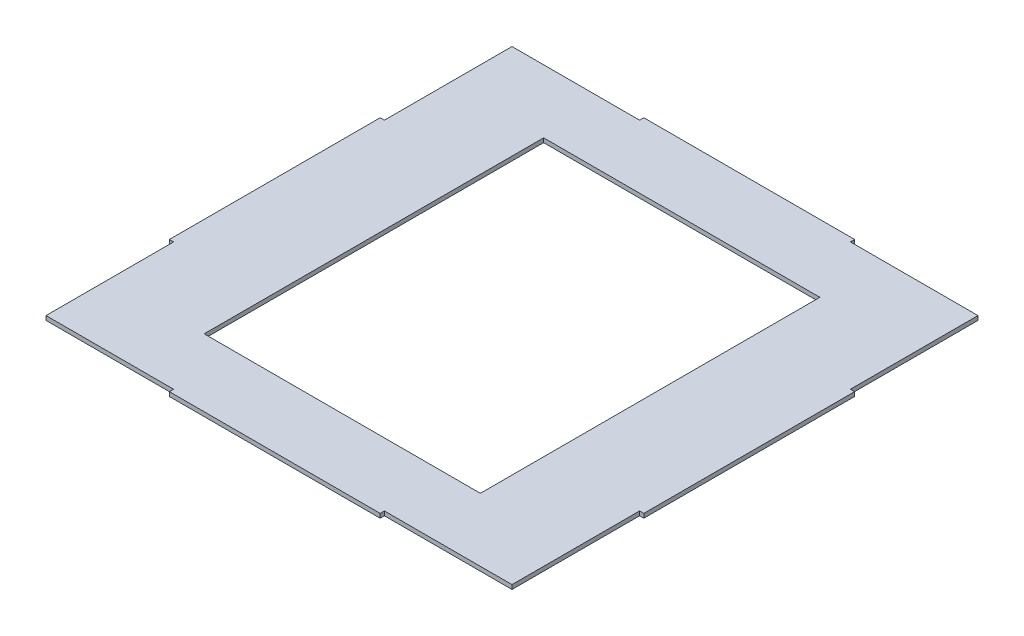
ISO-10303-21;
HEADER;
FILE_DESCRIPTION(('STEP AP214'),'2;1');
FILE_NAME('part.step','',(''),(''),'','','');
FILE_SCHEMA(('AUTOMOTIVE_DESIGN { 1 0 10303 214 1 1 1 1 }'));
ENDSEC;
DATA;
#1=APPLICATION_CONTEXT('core data for automotive mechanical design processes');
#2=APPLICATION_PROTOCOL_DEFINITION('international standard','automotive_design',2000,#1);
#3=PRODUCT_CONTEXT('',#1,'mechanical');
#4=PRODUCT('Part','Part','',(#3));
#5=PRODUCT_RELATED_PRODUCT_CATEGORY('part','',(#4));
#6=PRODUCT_DEFINITION_FORMATION('','',#4);
#7=PRODUCT_DEFINITION_CONTEXT('part definition',#1,'design');
#8=PRODUCT_DEFINITION('design','',#6,#7);
#9=PRODUCT_DEFINITION_SHAPE('','',#8);
#10=(LENGTH_UNIT() NAMED_UNIT(*) SI_UNIT(.MILLI.,.METRE.));
#11=(NAMED_UNIT(*) PLANE_ANGLE_UNIT() SI_UNIT($,.RADIAN.));
#12=(NAMED_UNIT(*) SI_UNIT($,.STERADIAN.) SOLID_ANGLE_UNIT());
#13=UNCERTAINTY_MEASURE_WITH_UNIT(LENGTH_MEASURE(1.E-05),#10,'distance_accuracy_value','');
#14=(GEOMETRIC_REPRESENTATION_CONTEXT(3) GLOBAL_UNCERTAINTY_ASSIGNED_CONTEXT((#13)) GLOBAL_UNIT_ASSIGNED_CONTEXT((#10,
#11,#12)) REPRESENTATION_CONTEXT('',''));
#15=CARTESIAN_POINT('',(0.,0.,0.));
#16=DIRECTION('',(0.,0.,1.));
#17=DIRECTION('',(1.,0.,0.));
#18=AXIS2_PLACEMENT_3D('',#15,#16,#17);
#19=CARTESIAN_POINT('',(0.,4.,-221.));
#20=DIRECTION('',(0.,0.,1.));
#21=DIRECTION('',(1.,0.,0.));
#22=AXIS2_PLACEMENT_3D('',#19,#20,#21);
#23=PLANE('',#22);
#24=DIRECTION('',(-1.,0.,0.));
#25=VECTOR('',#24,1.);
#26=CARTESIAN_POINT('',(0.,0.,-221.));
#27=LINE('',#26,#25);
#28=CARTESIAN_POINT('',(-100.,0.,-221.));
#29=VERTEX_POINT('',#28);
#30=CARTESIAN_POINT('',(-221.,0.,-221.));
#31=VERTEX_POINT('',#30);
#32=EDGE_CURVE('E248',#29,#31,#27,.T.);
#33=ORIENTED_EDGE('',*,*,#32,.T.);
#34=DIRECTION('',(0.,-1.,0.));
#35=VECTOR('',#34,1.);
#36=CARTESIAN_POINT('',(-221.,4.,-221.));
#37=LINE('',#36,#35);
#38=CARTESIAN_POINT('',(-221.,4.,-221.));
#39=VERTEX_POINT('',#38);
#40=EDGE_CURVE('E11',#39,#31,#37,.T.);
#41=ORIENTED_EDGE('',*,*,#40,.F.);
#42=DIRECTION('',(-1.,0.,0.));
#43=VECTOR('',#42,1.);
#44=CARTESIAN_POINT('',(0.,4.,-221.));
#45=LINE('',#44,#43);
#46=CARTESIAN_POINT('',(-100.,4.,-221.));
#47=VERTEX_POINT('',#46);
#48=EDGE_CURVE('E360',#47,#39,#45,.T.);
#49=ORIENTED_EDGE('',*,*,#48,.F.);
#50=DIRECTION('',(0.,-1.,0.));
#51=VECTOR('',#50,1.);
#52=CARTESIAN_POINT('',(-100.,4.,-221.));
#53=LINE('',#52,#51);
#54=EDGE_CURVE('E287',#47,#29,#53,.T.);
#55=ORIENTED_EDGE('',*,*,#54,.T.);
#56=EDGE_LOOP('',(#33,#41,#49,#55));
#57=FACE_BOUND('',#56,.T.);
#58=ADVANCED_FACE('F41',(#57),#23,.F.);
#59=CARTESIAN_POINT('',(-221.,4.,0.));
#60=DIRECTION('',(1.,0.,0.));
#61=DIRECTION('',(0.,0.,-1.));
#62=AXIS2_PLACEMENT_3D('',#59,#60,#61);
#63=PLANE('',#62);
#64=DIRECTION('',(0.,0.,1.));
#65=VECTOR('',#64,1.);
#66=CARTESIAN_POINT('',(-221.,0.,0.));
#67=LINE('',#66,#65);
#68=CARTESIAN_POINT('',(-221.,0.,-99.9999999999997));
#69=VERTEX_POINT('',#68);
#70=EDGE_CURVE('E251',#31,#69,#67,.T.);
#71=ORIENTED_EDGE('',*,*,#70,.T.);
#72=DIRECTION('',(0.,-1.,0.));
#73=VECTOR('',#72,1.);
#74=CARTESIAN_POINT('',(-221.,4.,-99.9999999999997));
#75=LINE('',#74,#73);
#76=CARTESIAN_POINT('',(-221.,4.,-99.9999999999997));
#77=VERTEX_POINT('',#76);
#78=EDGE_CURVE('E51',#77,#69,#75,.T.);
#79=ORIENTED_EDGE('',*,*,#78,.F.);
#80=DIRECTION('',(0.,0.,1.));
#81=VECTOR('',#80,1.);
#82=CARTESIAN_POINT('',(-221.,4.,0.));
#83=LINE('',#82,#81);
#84=EDGE_CURVE('E363',#39,#77,#83,.T.);
#85=ORIENTED_EDGE('',*,*,#84,.F.);
#86=ORIENTED_EDGE('',*,*,#40,.T.);
#87=EDGE_LOOP('',(#71,#79,#85,#86));
#88=FACE_BOUND('',#87,.T.);
#89=ADVANCED_FACE('F423',(#88),#63,.F.);
#90=CARTESIAN_POINT('',(1.38777878078138E-12,4.,-99.9999999999967));
#91=DIRECTION('',(0.,0.,1.));
#92=DIRECTION('',(1.,0.,0.));
#93=AXIS2_PLACEMENT_3D('',#90,#91,#92);
#94=PLANE('',#93);
#95=DIRECTION('',(-1.,0.,0.));
#96=VECTOR('',#95,1.);
#97=CARTESIAN_POINT('',(1.38777878078138E-12,0.,-99.9999999999967));
#98=LINE('',#97,#96);
#99=CARTESIAN_POINT('',(-225.,0.,-99.9999999999998));
#100=VERTEX_POINT('',#99);
#101=EDGE_CURVE('E253',#69,#100,#98,.T.);
#102=ORIENTED_EDGE('',*,*,#101,.T.);
#103=DIRECTION('',(0.,-1.,0.));
#104=VECTOR('',#103,1.);
#105=CARTESIAN_POINT('',(-225.,4.,-99.9999999999998));
#106=LINE('',#105,#104);
#107=CARTESIAN_POINT('',(-225.,4.,-99.9999999999998));
#108=VERTEX_POINT('',#107);
#109=EDGE_CURVE('E330',#108,#100,#106,.T.);
#110=ORIENTED_EDGE('',*,*,#109,.F.);
#111=DIRECTION('',(-1.,0.,0.));
#112=VECTOR('',#111,1.);
#113=CARTESIAN_POINT('',(1.38777878078138E-12,4.,-99.9999999999967));
#114=LINE('',#113,#112);
#115=EDGE_CURVE('E369',#77,#108,#114,.T.);
#116=ORIENTED_EDGE('',*,*,#115,.F.);
#117=ORIENTED_EDGE('',*,*,#78,.T.);
#118=EDGE_LOOP('',(#102,#110,#116,#117));
#119=FACE_BOUND('',#118,.T.);
#120=ADVANCED_FACE('F428',(#119),#94,.F.);
#121=CARTESIAN_POINT('',(-225.,4.,0.));
#122=DIRECTION('',(1.,0.,0.));
#123=DIRECTION('',(0.,0.,-1.));
#124=AXIS2_PLACEMENT_3D('',#121,#122,#123);
#125=PLANE('',#124);
#126=DIRECTION('',(0.,0.,1.));
#127=VECTOR('',#126,1.);
#128=CARTESIAN_POINT('',(-225.,0.,0.));
#129=LINE('',#128,#127);
#130=CARTESIAN_POINT('',(-225.,0.,100.));
#131=VERTEX_POINT('',#130);
#132=EDGE_CURVE('E255',#100,#131,#129,.T.);
#133=ORIENTED_EDGE('',*,*,#132,.T.);
#134=DIRECTION('',(0.,-1.,0.));
#135=VECTOR('',#134,1.);
#136=CARTESIAN_POINT('',(-225.,4.,100.));
#137=LINE('',#136,#135);
#138=CARTESIAN_POINT('',(-225.,4.,100.));
#139=VERTEX_POINT('',#138);
#140=EDGE_CURVE('E327',#139,#131,#137,.T.);
#141=ORIENTED_EDGE('',*,*,#140,.F.);
#142=DIRECTION('',(0.,0.,1.));
#143=VECTOR('',#142,1.);
#144=CARTESIAN_POINT('',(-225.,4.,0.));
#145=LINE('',#144,#143);
#146=EDGE_CURVE('E371',#108,#139,#145,.T.);
#147=ORIENTED_EDGE('',*,*,#146,.F.);
#148=ORIENTED_EDGE('',*,*,#109,.T.);
#149=EDGE_LOOP('',(#133,#141,#147,#148));
#150=FACE_BOUND('',#149,.T.);
#151=ADVANCED_FACE('F493',(#150),#125,.F.);
#152=CARTESIAN_POINT('',(0.,4.,100.));
#153=DIRECTION('',(0.,0.,-1.));
#154=DIRECTION('',(-1.,0.,0.));
#155=AXIS2_PLACEMENT_3D('',#152,#153,#154);
#156=PLANE('',#155);
#157=DIRECTION('',(1.,0.,0.));
#158=VECTOR('',#157,1.);
#159=CARTESIAN_POINT('',(0.,0.,100.));
#160=LINE('',#159,#158);
#161=CARTESIAN_POINT('',(-221.,0.,100.));
#162=VERTEX_POINT('',#161);
#163=EDGE_CURVE('E257',#131,#162,#160,.T.);
#164=ORIENTED_EDGE('',*,*,#163,.T.);
#165=DIRECTION('',(0.,-1.,0.));
#166=VECTOR('',#165,1.);
#167=CARTESIAN_POINT('',(-221.,4.,100.));
#168=LINE('',#167,#166);
#169=CARTESIAN_POINT('',(-221.,4.,100.));
#170=VERTEX_POINT('',#169);
#171=EDGE_CURVE('E324',#170,#162,#168,.T.);
#172=ORIENTED_EDGE('',*,*,#171,.F.);
#173=DIRECTION('',(1.,0.,0.));
#174=VECTOR('',#173,1.);
#175=CARTESIAN_POINT('',(0.,4.,100.));
#176=LINE('',#175,#174);
#177=EDGE_CURVE('E373',#139,#170,#176,.T.);
#178=ORIENTED_EDGE('',*,*,#177,.F.);
#179=ORIENTED_EDGE('',*,*,#140,.T.);
#180=EDGE_LOOP('',(#164,#172,#178,#179));
#181=FACE_BOUND('',#180,.T.);
#182=ADVANCED_FACE('F489',(#181),#156,.F.);
#183=CARTESIAN_POINT('',(-221.,4.,0.));
#184=DIRECTION('',(1.,0.,0.));
#185=DIRECTION('',(0.,0.,-1.));
#186=AXIS2_PLACEMENT_3D('',#183,#184,#185);
#187=PLANE('',#186);
#188=DIRECTION('',(0.,0.,1.));
#189=VECTOR('',#188,1.);
#190=CARTESIAN_POINT('',(-221.,0.,0.));
#191=LINE('',#190,#189);
#192=CARTESIAN_POINT('',(-221.,0.,221.));
#193=VERTEX_POINT('',#192);
#194=EDGE_CURVE('E259',#162,#193,#191,.T.);
#195=ORIENTED_EDGE('',*,*,#194,.T.);
#196=DIRECTION('',(0.,-1.,0.));
#197=VECTOR('',#196,1.);
#198=CARTESIAN_POINT('',(-221.,4.,221.));
#199=LINE('',#198,#197);
#200=CARTESIAN_POINT('',(-221.,4.,221.));
#201=VERTEX_POINT('',#200);
#202=EDGE_CURVE('E321',#201,#193,#199,.T.);
#203=ORIENTED_EDGE('',*,*,#202,.F.);
#204=DIRECTION('',(0.,0.,1.));
#205=VECTOR('',#204,1.);
#206=CARTESIAN_POINT('',(-221.,4.,0.));
#207=LINE('',#206,#205);
#208=EDGE_CURVE('E375',#170,#201,#207,.T.);
#209=ORIENTED_EDGE('',*,*,#208,.F.);
#210=ORIENTED_EDGE('',*,*,#171,.T.);
#211=EDGE_LOOP('',(#195,#203,#209,#210));
#212=FACE_BOUND('',#211,.T.);
#213=ADVANCED_FACE('F485',(#212),#187,.F.);
#214=CARTESIAN_POINT('',(0.,4.,221.));
#215=DIRECTION('',(0.,0.,-1.));
#216=DIRECTION('',(-1.,0.,0.));
#217=AXIS2_PLACEMENT_3D('',#214,#215,#216);
#218=PLANE('',#217);
#219=DIRECTION('',(1.,0.,0.));
#220=VECTOR('',#219,1.);
#221=CARTESIAN_POINT('',(0.,0.,221.));
#222=LINE('',#221,#220);
#223=CARTESIAN_POINT('',(-100.,0.,221.));
#224=VERTEX_POINT('',#223);
#225=EDGE_CURVE('E261',#193,#224,#222,.T.);
#226=ORIENTED_EDGE('',*,*,#225,.T.);
#227=DIRECTION('',(0.,-1.,0.));
#228=VECTOR('',#227,1.);
#229=CARTESIAN_POINT('',(-100.,4.,221.));
#230=LINE('',#229,#228);
#231=CARTESIAN_POINT('',(-100.,4.,221.));
#232=VERTEX_POINT('',#231);
#233=EDGE_CURVE('E318',#232,#224,#230,.T.);
#234=ORIENTED_EDGE('',*,*,#233,.F.);
#235=DIRECTION('',(1.,0.,0.));
#236=VECTOR('',#235,1.);
#237=CARTESIAN_POINT('',(0.,4.,221.));
#238=LINE('',#237,#236);
#239=EDGE_CURVE('E377',#201,#232,#238,.T.);
#240=ORIENTED_EDGE('',*,*,#239,.F.);
#241=ORIENTED_EDGE('',*,*,#202,.T.);
#242=EDGE_LOOP('',(#226,#234,#240,#241));
#243=FACE_BOUND('',#242,.T.);
#244=ADVANCED_FACE('F481',(#243),#218,.F.);
#245=CARTESIAN_POINT('',(-100.,4.,0.));
#246=DIRECTION('',(1.,0.,0.));
#247=DIRECTION('',(0.,0.,-1.));
#248=AXIS2_PLACEMENT_3D('',#245,#246,#247);
#249=PLANE('',#248);
#250=DIRECTION('',(0.,0.,1.));
#251=VECTOR('',#250,1.);
#252=CARTESIAN_POINT('',(-100.,0.,0.));
#253=LINE('',#252,#251);
#254=CARTESIAN_POINT('',(-100.,0.,225.));
#255=VERTEX_POINT('',#254);
#256=EDGE_CURVE('E263',#224,#255,#253,.T.);
#257=ORIENTED_EDGE('',*,*,#256,.T.);
#258=DIRECTION('',(0.,-1.,0.));
#259=VECTOR('',#258,1.);
#260=CARTESIAN_POINT('',(-100.,4.,225.));
#261=LINE('',#260,#259);
#262=CARTESIAN_POINT('',(-100.,4.,225.));
#263=VERTEX_POINT('',#262);
#264=EDGE_CURVE('E315',#263,#255,#261,.T.);
#265=ORIENTED_EDGE('',*,*,#264,.F.);
#266=DIRECTION('',(0.,0.,1.));
#267=VECTOR('',#266,1.);
#268=CARTESIAN_POINT('',(-100.,4.,0.));
#269=LINE('',#268,#267);
#270=EDGE_CURVE('E379',#232,#263,#269,.T.);
#271=ORIENTED_EDGE('',*,*,#270,.F.);
#272=ORIENTED_EDGE('',*,*,#233,.T.);
#273=EDGE_LOOP('',(#257,#265,#271,#272));
#274=FACE_BOUND('',#273,.T.);
#275=ADVANCED_FACE('F477',(#274),#249,.F.);
#276=CARTESIAN_POINT('',(0.,4.,225.));
#277=DIRECTION('',(0.,0.,-1.));
#278=DIRECTION('',(-1.,0.,0.));
#279=AXIS2_PLACEMENT_3D('',#276,#277,#278);
#280=PLANE('',#279);
#281=DIRECTION('',(1.,0.,0.));
#282=VECTOR('',#281,1.);
#283=CARTESIAN_POINT('',(0.,0.,225.));
#284=LINE('',#283,#282);
#285=CARTESIAN_POINT('',(100.,0.,225.));
#286=VERTEX_POINT('',#285);
#287=EDGE_CURVE('E265',#255,#286,#284,.T.);
#288=ORIENTED_EDGE('',*,*,#287,.T.);
#289=DIRECTION('',(0.,-1.,0.));
#290=VECTOR('',#289,1.);
#291=CARTESIAN_POINT('',(100.,4.,225.));
#292=LINE('',#291,#290);
#293=CARTESIAN_POINT('',(100.,4.,225.));
#294=VERTEX_POINT('',#293);
#295=EDGE_CURVE('E312',#294,#286,#292,.T.);
#296=ORIENTED_EDGE('',*,*,#295,.F.);
#297=DIRECTION('',(1.,0.,0.));
#298=VECTOR('',#297,1.);
#299=CARTESIAN_POINT('',(0.,4.,225.));
#300=LINE('',#299,#298);
#301=EDGE_CURVE('E381',#263,#294,#300,.T.);
#302=ORIENTED_EDGE('',*,*,#301,.F.);
#303=ORIENTED_EDGE('',*,*,#264,.T.);
#304=EDGE_LOOP('',(#288,#296,#302,#303));
#305=FACE_BOUND('',#304,.T.);
#306=ADVANCED_FACE('F473',(#305),#280,.F.);
#307=CARTESIAN_POINT('',(100.,4.,0.));
#308=DIRECTION('',(-1.,0.,0.));
#309=DIRECTION('',(0.,0.,1.));
#310=AXIS2_PLACEMENT_3D('',#307,#308,#309);
#311=PLANE('',#310);
#312=DIRECTION('',(0.,0.,-1.));
#313=VECTOR('',#312,1.);
#314=CARTESIAN_POINT('',(100.,0.,0.));
#315=LINE('',#314,#313);
#316=CARTESIAN_POINT('',(100.,0.,221.));
#317=VERTEX_POINT('',#316);
#318=EDGE_CURVE('E267',#286,#317,#315,.T.);
#319=ORIENTED_EDGE('',*,*,#318,.T.);
#320=DIRECTION('',(0.,-1.,0.));
#321=VECTOR('',#320,1.);
#322=CARTESIAN_POINT('',(100.,4.,221.));
#323=LINE('',#322,#321);
#324=CARTESIAN_POINT('',(100.,4.,221.));
#325=VERTEX_POINT('',#324);
#326=EDGE_CURVE('E309',#325,#317,#323,.T.);
#327=ORIENTED_EDGE('',*,*,#326,.F.);
#328=DIRECTION('',(0.,0.,-1.));
#329=VECTOR('',#328,1.);
#330=CARTESIAN_POINT('',(100.,4.,0.));
#331=LINE('',#330,#329);
#332=EDGE_CURVE('E383',#294,#325,#331,.T.);
#333=ORIENTED_EDGE('',*,*,#332,.F.);
#334=ORIENTED_EDGE('',*,*,#295,.T.);
#335=EDGE_LOOP('',(#319,#327,#333,#334));
#336=FACE_BOUND('',#335,.T.);
#337=ADVANCED_FACE('F469',(#336),#311,.F.);
#338=CARTESIAN_POINT('',(0.,4.,221.));
#339=DIRECTION('',(0.,0.,-1.));
#340=DIRECTION('',(-1.,0.,0.));
#341=AXIS2_PLACEMENT_3D('',#338,#339,#340);
#342=PLANE('',#341);
#343=DIRECTION('',(1.,0.,0.));
#344=VECTOR('',#343,1.);
#345=CARTESIAN_POINT('',(0.,0.,221.));
#346=LINE('',#345,#344);
#347=CARTESIAN_POINT('',(221.,0.,221.));
#348=VERTEX_POINT('',#347);
#349=EDGE_CURVE('E269',#317,#348,#346,.T.);
#350=ORIENTED_EDGE('',*,*,#349,.T.);
#351=DIRECTION('',(0.,-1.,0.));
#352=VECTOR('',#351,1.);
#353=CARTESIAN_POINT('',(221.,4.,221.));
#354=LINE('',#353,#352);
#355=CARTESIAN_POINT('',(221.,4.,221.));
#356=VERTEX_POINT('',#355);
#357=EDGE_CURVE('E306',#356,#348,#354,.T.);
#358=ORIENTED_EDGE('',*,*,#357,.F.);
#359=DIRECTION('',(1.,0.,0.));
#360=VECTOR('',#359,1.);
#361=CARTESIAN_POINT('',(0.,4.,221.));
#362=LINE('',#361,#360);
#363=EDGE_CURVE('E385',#325,#356,#362,.T.);
#364=ORIENTED_EDGE('',*,*,#363,.F.);
#365=ORIENTED_EDGE('',*,*,#326,.T.);
#366=EDGE_LOOP('',(#350,#358,#364,#365));
#367=FACE_BOUND('',#366,.T.);
#368=ADVANCED_FACE('F465',(#367),#342,.F.);
#369=CARTESIAN_POINT('',(221.,4.,0.));
#370=DIRECTION('',(-1.,0.,0.));
#371=DIRECTION('',(0.,0.,1.));
#372=AXIS2_PLACEMENT_3D('',#369,#370,#371);
#373=PLANE('',#372);
#374=DIRECTION('',(0.,0.,-1.));
#375=VECTOR('',#374,1.);
#376=CARTESIAN_POINT('',(221.,0.,0.));
#377=LINE('',#376,#375);
#378=CARTESIAN_POINT('',(221.,0.,99.9999999999999));
#379=VERTEX_POINT('',#378);
#380=EDGE_CURVE('E271',#348,#379,#377,.T.);
#381=ORIENTED_EDGE('',*,*,#380,.T.);
#382=DIRECTION('',(0.,-1.,0.));
#383=VECTOR('',#382,1.);
#384=CARTESIAN_POINT('',(221.,4.,99.9999999999999));
#385=LINE('',#384,#383);
#386=CARTESIAN_POINT('',(221.,4.,99.9999999999999));
#387=VERTEX_POINT('',#386);
#388=EDGE_CURVE('E303',#387,#379,#385,.T.);
#389=ORIENTED_EDGE('',*,*,#388,.F.);
#390=DIRECTION('',(0.,0.,-1.));
#391=VECTOR('',#390,1.);
#392=CARTESIAN_POINT('',(221.,4.,0.));
#393=LINE('',#392,#391);
#394=EDGE_CURVE('E387',#356,#387,#393,.T.);
#395=ORIENTED_EDGE('',*,*,#394,.F.);
#396=ORIENTED_EDGE('',*,*,#357,.T.);
#397=EDGE_LOOP('',(#381,#389,#395,#396));
#398=FACE_BOUND('',#397,.T.);
#399=ADVANCED_FACE('F461',(#398),#373,.F.);
#400=CARTESIAN_POINT('',(0.,4.,99.9999999999999));
#401=DIRECTION('',(0.,0.,-1.));
#402=DIRECTION('',(-1.,0.,0.));
#403=AXIS2_PLACEMENT_3D('',#400,#401,#402);
#404=PLANE('',#403);
#405=DIRECTION('',(1.,0.,0.));
#406=VECTOR('',#405,1.);
#407=CARTESIAN_POINT('',(0.,0.,99.9999999999999));
#408=LINE('',#407,#406);
#409=CARTESIAN_POINT('',(225.,0.,99.9999999999999));
#410=VERTEX_POINT('',#409);
#411=EDGE_CURVE('E273',#379,#410,#408,.T.);
#412=ORIENTED_EDGE('',*,*,#411,.T.);
#413=DIRECTION('',(0.,-1.,0.));
#414=VECTOR('',#413,1.);
#415=CARTESIAN_POINT('',(225.,4.,99.9999999999999));
#416=LINE('',#415,#414);
#417=CARTESIAN_POINT('',(225.,4.,99.9999999999999));
#418=VERTEX_POINT('',#417);
#419=EDGE_CURVE('E300',#418,#410,#416,.T.);
#420=ORIENTED_EDGE('',*,*,#419,.F.);
#421=DIRECTION('',(1.,0.,0.));
#422=VECTOR('',#421,1.);
#423=CARTESIAN_POINT('',(0.,4.,99.9999999999999));
#424=LINE('',#423,#422);
#425=EDGE_CURVE('E389',#387,#418,#424,.T.);
#426=ORIENTED_EDGE('',*,*,#425,.F.);
#427=ORIENTED_EDGE('',*,*,#388,.T.);
#428=EDGE_LOOP('',(#412,#420,#426,#427));
#429=FACE_BOUND('',#428,.T.);
#430=ADVANCED_FACE('F457',(#429),#404,.F.);
#431=CARTESIAN_POINT('',(225.,4.,0.));
#432=DIRECTION('',(-1.,0.,0.));
#433=DIRECTION('',(0.,0.,1.));
#434=AXIS2_PLACEMENT_3D('',#431,#432,#433);
#435=PLANE('',#434);
#436=DIRECTION('',(0.,0.,-1.));
#437=VECTOR('',#436,1.);
#438=CARTESIAN_POINT('',(225.,0.,0.));
#439=LINE('',#438,#437);
#440=CARTESIAN_POINT('',(225.,0.,-100.));
#441=VERTEX_POINT('',#440);
#442=EDGE_CURVE('E275',#410,#441,#439,.T.);
#443=ORIENTED_EDGE('',*,*,#442,.T.);
#444=DIRECTION('',(0.,-1.,0.));
#445=VECTOR('',#444,1.);
#446=CARTESIAN_POINT('',(225.,4.,-100.));
#447=LINE('',#446,#445);
#448=CARTESIAN_POINT('',(225.,4.,-100.));
#449=VERTEX_POINT('',#448);
#450=EDGE_CURVE('E297',#449,#441,#447,.T.);
#451=ORIENTED_EDGE('',*,*,#450,.F.);
#452=DIRECTION('',(0.,0.,-1.));
#453=VECTOR('',#452,1.);
#454=CARTESIAN_POINT('',(225.,4.,0.));
#455=LINE('',#454,#453);
#456=EDGE_CURVE('E391',#418,#449,#455,.T.);
#457=ORIENTED_EDGE('',*,*,#456,.F.);
#458=ORIENTED_EDGE('',*,*,#419,.T.);
#459=EDGE_LOOP('',(#443,#451,#457,#458));
#460=FACE_BOUND('',#459,.T.);
#461=ADVANCED_FACE('F453',(#460),#435,.F.);
#462=CARTESIAN_POINT('',(0.,4.,-100.));
#463=DIRECTION('',(0.,0.,1.));
#464=DIRECTION('',(1.,0.,0.));
#465=AXIS2_PLACEMENT_3D('',#462,#463,#464);
#466=PLANE('',#465);
#467=DIRECTION('',(-1.,0.,0.));
#468=VECTOR('',#467,1.);
#469=CARTESIAN_POINT('',(0.,0.,-100.));
#470=LINE('',#469,#468);
#471=CARTESIAN_POINT('',(221.,0.,-100.));
#472=VERTEX_POINT('',#471);
#473=EDGE_CURVE('E277',#441,#472,#470,.T.);
#474=ORIENTED_EDGE('',*,*,#473,.T.);
#475=DIRECTION('',(0.,-1.,0.));
#476=VECTOR('',#475,1.);
#477=CARTESIAN_POINT('',(221.,4.,-100.));
#478=LINE('',#477,#476);
#479=CARTESIAN_POINT('',(221.,4.,-100.));
#480=VERTEX_POINT('',#479);
#481=EDGE_CURVE('E294',#480,#472,#478,.T.);
#482=ORIENTED_EDGE('',*,*,#481,.F.);
#483=DIRECTION('',(-1.,0.,0.));
#484=VECTOR('',#483,1.);
#485=CARTESIAN_POINT('',(0.,4.,-100.));
#486=LINE('',#485,#484);
#487=EDGE_CURVE('E393',#449,#480,#486,.T.);
#488=ORIENTED_EDGE('',*,*,#487,.F.);
#489=ORIENTED_EDGE('',*,*,#450,.T.);
#490=EDGE_LOOP('',(#474,#482,#488,#489));
#491=FACE_BOUND('',#490,.T.);
#492=ADVANCED_FACE('F450',(#491),#466,.F.);
#493=CARTESIAN_POINT('',(221.,4.,0.));
#494=DIRECTION('',(-1.,0.,0.));
#495=DIRECTION('',(0.,0.,1.));
#496=AXIS2_PLACEMENT_3D('',#493,#494,#495);
#497=PLANE('',#496);
#498=DIRECTION('',(0.,0.,-1.));
#499=VECTOR('',#498,1.);
#500=CARTESIAN_POINT('',(221.,0.,0.));
#501=LINE('',#500,#499);
#502=CARTESIAN_POINT('',(221.,0.,-221.));
#503=VERTEX_POINT('',#502);
#504=EDGE_CURVE('E279',#472,#503,#501,.T.);
#505=ORIENTED_EDGE('',*,*,#504,.T.);
#506=DIRECTION('',(0.,-1.,0.));
#507=VECTOR('',#506,1.);
#508=CARTESIAN_POINT('',(221.,4.,-221.));
#509=LINE('',#508,#507);
#510=CARTESIAN_POINT('',(221.,4.,-221.));
#511=VERTEX_POINT('',#510);
#512=EDGE_CURVE('E291',#511,#503,#509,.T.);
#513=ORIENTED_EDGE('',*,*,#512,.F.);
#514=DIRECTION('',(0.,0.,-1.));
#515=VECTOR('',#514,1.);
#516=CARTESIAN_POINT('',(221.,4.,0.));
#517=LINE('',#516,#515);
#518=EDGE_CURVE('E395',#480,#511,#517,.T.);
#519=ORIENTED_EDGE('',*,*,#518,.F.);
#520=ORIENTED_EDGE('',*,*,#481,.T.);
#521=EDGE_LOOP('',(#505,#513,#519,#520));
#522=FACE_BOUND('',#521,.T.);
#523=ADVANCED_FACE('F401',(#522),#497,.F.);
#524=CARTESIAN_POINT('',(0.,4.,-221.));
#525=DIRECTION('',(0.,0.,1.));
#526=DIRECTION('',(1.,0.,0.));
#527=AXIS2_PLACEMENT_3D('',#524,#525,#526);
#528=PLANE('',#527);
#529=DIRECTION('',(-1.,0.,0.));
#530=VECTOR('',#529,1.);
#531=CARTESIAN_POINT('',(0.,0.,-221.));
#532=LINE('',#531,#530);
#533=CARTESIAN_POINT('',(100.,0.,-221.));
#534=VERTEX_POINT('',#533);
#535=EDGE_CURVE('E281',#503,#534,#532,.T.);
#536=ORIENTED_EDGE('',*,*,#535,.T.);
#537=DIRECTION('',(0.,-1.,0.));
#538=VECTOR('',#537,1.);
#539=CARTESIAN_POINT('',(100.,4.,-221.));
#540=LINE('',#539,#538);
#541=CARTESIAN_POINT('',(100.,4.,-221.));
#542=VERTEX_POINT('',#541);
#543=EDGE_CURVE('E228',#542,#534,#540,.T.);
#544=ORIENTED_EDGE('',*,*,#543,.F.);
#545=DIRECTION('',(-1.,0.,0.));
#546=VECTOR('',#545,1.);
#547=CARTESIAN_POINT('',(0.,4.,-221.));
#548=LINE('',#547,#546);
#549=EDGE_CURVE('E219',#511,#542,#548,.T.);
#550=ORIENTED_EDGE('',*,*,#549,.F.);
#551=ORIENTED_EDGE('',*,*,#512,.T.);
#552=EDGE_LOOP('',(#536,#544,#550,#551));
#553=FACE_BOUND('',#552,.T.);
#554=ADVANCED_FACE('F405',(#553),#528,.F.);
#555=CARTESIAN_POINT('',(99.9999999999992,4.,3.46944695195366E-13));
#556=DIRECTION('',(-1.,0.,0.));
#557=DIRECTION('',(0.,0.,1.));
#558=AXIS2_PLACEMENT_3D('',#555,#556,#557);
#559=PLANE('',#558);
#560=DIRECTION('',(0.,0.,-1.));
#561=VECTOR('',#560,1.);
#562=CARTESIAN_POINT('',(99.9999999999992,0.,3.46944695195366E-13));
#563=LINE('',#562,#561);
#564=CARTESIAN_POINT('',(100.,0.,-225.));
#565=VERTEX_POINT('',#564);
#566=EDGE_CURVE('E227',#534,#565,#563,.T.);
#567=ORIENTED_EDGE('',*,*,#566,.T.);
#568=DIRECTION('',(0.,-1.,0.));
#569=VECTOR('',#568,1.);
#570=CARTESIAN_POINT('',(100.,4.,-225.));
#571=LINE('',#570,#569);
#572=CARTESIAN_POINT('',(100.,4.,-225.));
#573=VERTEX_POINT('',#572);
#574=EDGE_CURVE('E224',#573,#565,#571,.T.);
#575=ORIENTED_EDGE('',*,*,#574,.F.);
#576=DIRECTION('',(0.,0.,-1.));
#577=VECTOR('',#576,1.);
#578=CARTESIAN_POINT('',(99.9999999999992,4.,3.46944695195366E-13));
#579=LINE('',#578,#577);
#580=EDGE_CURVE('E213',#542,#573,#579,.T.);
#581=ORIENTED_EDGE('',*,*,#580,.F.);
#582=ORIENTED_EDGE('',*,*,#543,.T.);
#583=EDGE_LOOP('',(#567,#575,#581,#582));
#584=FACE_BOUND('',#583,.T.);
#585=ADVANCED_FACE('F225',(#584),#559,.F.);
#586=CARTESIAN_POINT('',(0.,4.,-225.));
#587=DIRECTION('',(0.,0.,1.));
#588=DIRECTION('',(1.,0.,0.));
#589=AXIS2_PLACEMENT_3D('',#586,#587,#588);
#590=PLANE('',#589);
#591=DIRECTION('',(-1.,0.,0.));
#592=VECTOR('',#591,1.);
#593=CARTESIAN_POINT('',(0.,0.,-225.));
#594=LINE('',#593,#592);
#595=CARTESIAN_POINT('',(-100.,0.,-225.));
#596=VERTEX_POINT('',#595);
#597=EDGE_CURVE('E137',#565,#596,#594,.T.);
#598=ORIENTED_EDGE('',*,*,#597,.T.);
#599=DIRECTION('',(0.,-1.,0.));
#600=VECTOR('',#599,1.);
#601=CARTESIAN_POINT('',(-100.,4.,-225.));
#602=LINE('',#601,#600);
#603=CARTESIAN_POINT('',(-100.,4.,-225.));
#604=VERTEX_POINT('',#603);
#605=EDGE_CURVE('E229',#604,#596,#602,.T.);
#606=ORIENTED_EDGE('',*,*,#605,.F.);
#607=DIRECTION('',(-1.,0.,0.));
#608=VECTOR('',#607,1.);
#609=CARTESIAN_POINT('',(0.,4.,-225.));
#610=LINE('',#609,#608);
#611=EDGE_CURVE('E217',#573,#604,#610,.T.);
#612=ORIENTED_EDGE('',*,*,#611,.F.);
#613=ORIENTED_EDGE('',*,*,#574,.T.);
#614=EDGE_LOOP('',(#598,#606,#612,#613));
#615=FACE_BOUND('',#614,.T.);
#616=ADVANCED_FACE('F231',(#615),#590,.F.);
#617=CARTESIAN_POINT('',(131.,4.,0.));
#618=DIRECTION('',(-1.,0.,0.));
#619=DIRECTION('',(0.,0.,1.));
#620=AXIS2_PLACEMENT_3D('',#617,#618,#619);
#621=PLANE('',#620);
#622=DIRECTION('',(0.,0.,-1.));
#623=VECTOR('',#622,1.);
#624=CARTESIAN_POINT('',(131.,0.,0.));
#625=LINE('',#624,#623);
#626=CARTESIAN_POINT('',(131.,0.,161.));
#627=VERTEX_POINT('',#626);
#628=CARTESIAN_POINT('',(131.,0.,-161.));
#629=VERTEX_POINT('',#628);
#630=EDGE_CURVE('E237',#627,#629,#625,.T.);
#631=ORIENTED_EDGE('',*,*,#630,.F.);
#632=DIRECTION('',(0.,-1.,0.));
#633=VECTOR('',#632,1.);
#634=CARTESIAN_POINT('',(131.,4.,161.));
#635=LINE('',#634,#633);
#636=CARTESIAN_POINT('',(131.,4.,161.));
#637=VERTEX_POINT('',#636);
#638=EDGE_CURVE('E45',#637,#627,#635,.T.);
#639=ORIENTED_EDGE('',*,*,#638,.F.);
#640=DIRECTION('',(0.,0.,-1.));
#641=VECTOR('',#640,1.);
#642=CARTESIAN_POINT('',(131.,4.,0.));
#643=LINE('',#642,#641);
#644=CARTESIAN_POINT('',(131.,4.,-161.));
#645=VERTEX_POINT('',#644);
#646=EDGE_CURVE('E286',#637,#645,#643,.T.);
#647=ORIENTED_EDGE('',*,*,#646,.T.);
#648=DIRECTION('',(0.,-1.,0.));
#649=VECTOR('',#648,1.);
#650=CARTESIAN_POINT('',(131.,4.,-161.));
#651=LINE('',#650,#649);
#652=EDGE_CURVE('E233',#645,#629,#651,.T.);
#653=ORIENTED_EDGE('',*,*,#652,.T.);
#654=EDGE_LOOP('',(#631,#639,#647,#653));
#655=FACE_BOUND('',#654,.T.);
#656=ADVANCED_FACE('F43',(#655),#621,.T.);
#657=CARTESIAN_POINT('',(0.,4.,161.));
#658=DIRECTION('',(0.,0.,-1.));
#659=DIRECTION('',(-1.,0.,0.));
#660=AXIS2_PLACEMENT_3D('',#657,#658,#659);
#661=PLANE('',#660);
#662=DIRECTION('',(1.,0.,0.));
#663=VECTOR('',#662,1.);
#664=CARTESIAN_POINT('',(0.,0.,161.));
#665=LINE('',#664,#663);
#666=CARTESIAN_POINT('',(-131.,0.,161.));
#667=VERTEX_POINT('',#666);
#668=EDGE_CURVE('E240',#667,#627,#665,.T.);
#669=ORIENTED_EDGE('',*,*,#668,.F.);
#670=DIRECTION('',(0.,-1.,0.));
#671=VECTOR('',#670,1.);
#672=CARTESIAN_POINT('',(-131.,4.,161.));
#673=LINE('',#672,#671);
#674=CARTESIAN_POINT('',(-131.,4.,161.));
#675=VERTEX_POINT('',#674);
#676=EDGE_CURVE('E338',#675,#667,#673,.T.);
#677=ORIENTED_EDGE('',*,*,#676,.F.);
#678=DIRECTION('',(1.,0.,0.));
#679=VECTOR('',#678,1.);
#680=CARTESIAN_POINT('',(0.,4.,161.));
#681=LINE('',#680,#679);
#682=EDGE_CURVE('E347',#675,#637,#681,.T.);
#683=ORIENTED_EDGE('',*,*,#682,.T.);
#684=ORIENTED_EDGE('',*,*,#638,.T.);
#685=EDGE_LOOP('',(#669,#677,#683,#684));
#686=FACE_BOUND('',#685,.T.);
#687=ADVANCED_FACE('F345',(#686),#661,.T.);
#688=CARTESIAN_POINT('',(-131.,4.,0.));
#689=DIRECTION('',(-1.,0.,0.));
#690=DIRECTION('',(0.,0.,1.));
#691=AXIS2_PLACEMENT_3D('',#688,#689,#690);
#692=PLANE('',#691);
#693=DIRECTION('',(0.,0.,-1.));
#694=VECTOR('',#693,1.);
#695=CARTESIAN_POINT('',(-131.,0.,0.));
#696=LINE('',#695,#694);
#697=CARTESIAN_POINT('',(-131.,0.,-161.));
#698=VERTEX_POINT('',#697);
#699=EDGE_CURVE('E243',#667,#698,#696,.T.);
#700=ORIENTED_EDGE('',*,*,#699,.T.);
#701=DIRECTION('',(0.,-1.,0.));
#702=VECTOR('',#701,1.);
#703=CARTESIAN_POINT('',(-131.,4.,-161.));
#704=LINE('',#703,#702);
#705=CARTESIAN_POINT('',(-131.,4.,-161.));
#706=VERTEX_POINT('',#705);
#707=EDGE_CURVE('E336',#706,#698,#704,.T.);
#708=ORIENTED_EDGE('',*,*,#707,.F.);
#709=DIRECTION('',(0.,0.,-1.));
#710=VECTOR('',#709,1.);
#711=CARTESIAN_POINT('',(-131.,4.,0.));
#712=LINE('',#711,#710);
#713=EDGE_CURVE('E361',#675,#706,#712,.T.);
#714=ORIENTED_EDGE('',*,*,#713,.F.);
#715=ORIENTED_EDGE('',*,*,#676,.T.);
#716=EDGE_LOOP('',(#700,#708,#714,#715));
#717=FACE_BOUND('',#716,.T.);
#718=ADVANCED_FACE('F354',(#717),#692,.F.);
#719=CARTESIAN_POINT('',(0.,4.,-161.));
#720=DIRECTION('',(0.,0.,-1.));
#721=DIRECTION('',(-1.,0.,0.));
#722=AXIS2_PLACEMENT_3D('',#719,#720,#721);
#723=PLANE('',#722);
#724=DIRECTION('',(1.,0.,0.));
#725=VECTOR('',#724,1.);
#726=CARTESIAN_POINT('',(0.,0.,-161.));
#727=LINE('',#726,#725);
#728=EDGE_CURVE('E245',#698,#629,#727,.T.);
#729=ORIENTED_EDGE('',*,*,#728,.T.);
#730=ORIENTED_EDGE('',*,*,#652,.F.);
#731=DIRECTION('',(1.,0.,0.));
#732=VECTOR('',#731,1.);
#733=CARTESIAN_POINT('',(0.,4.,-161.));
#734=LINE('',#733,#732);
#735=EDGE_CURVE('E358',#706,#645,#734,.T.);
#736=ORIENTED_EDGE('',*,*,#735,.F.);
#737=ORIENTED_EDGE('',*,*,#707,.T.);
#738=EDGE_LOOP('',(#729,#730,#736,#737));
#739=FACE_BOUND('',#738,.T.);
#740=ADVANCED_FACE('F357',(#739),#723,.F.);
#741=CARTESIAN_POINT('',(-100.,4.,0.));
#742=DIRECTION('',(1.,0.,0.));
#743=DIRECTION('',(0.,0.,-1.));
#744=AXIS2_PLACEMENT_3D('',#741,#742,#743);
#745=PLANE('',#744);
#746=DIRECTION('',(0.,0.,1.));
#747=VECTOR('',#746,1.);
#748=CARTESIAN_POINT('',(-100.,0.,0.));
#749=LINE('',#748,#747);
#750=EDGE_CURVE('E143',#596,#29,#749,.T.);
#751=ORIENTED_EDGE('',*,*,#750,.T.);
#752=ORIENTED_EDGE('',*,*,#54,.F.);
#753=DIRECTION('',(0.,0.,1.));
#754=VECTOR('',#753,1.);
#755=CARTESIAN_POINT('',(-100.,4.,0.));
#756=LINE('',#755,#754);
#757=EDGE_CURVE('E60',#604,#47,#756,.T.);
#758=ORIENTED_EDGE('',*,*,#757,.F.);
#759=ORIENTED_EDGE('',*,*,#605,.T.);
#760=EDGE_LOOP('',(#751,#752,#758,#759));
#761=FACE_BOUND('',#760,.T.);
#762=ADVANCED_FACE('F411',(#761),#745,.F.);
#763=CARTESIAN_POINT('',(0.,4.,0.));
#764=DIRECTION('',(0.,1.,0.));
#765=DIRECTION('',(0.,0.,1.));
#766=AXIS2_PLACEMENT_3D('',#763,#764,#765);
#767=PLANE('',#766);
#768=ORIENTED_EDGE('',*,*,#646,.F.);
#769=ORIENTED_EDGE('',*,*,#682,.F.);
#770=ORIENTED_EDGE('',*,*,#713,.T.);
#771=ORIENTED_EDGE('',*,*,#735,.T.);
#772=EDGE_LOOP('',(#768,#769,#770,#771));
#773=FACE_BOUND('',#772,.T.);
#774=ORIENTED_EDGE('',*,*,#48,.T.);
#775=ORIENTED_EDGE('',*,*,#84,.T.);
#776=ORIENTED_EDGE('',*,*,#115,.T.);
#777=ORIENTED_EDGE('',*,*,#146,.T.);
#778=ORIENTED_EDGE('',*,*,#177,.T.);
#779=ORIENTED_EDGE('',*,*,#208,.T.);
#780=ORIENTED_EDGE('',*,*,#239,.T.);
#781=ORIENTED_EDGE('',*,*,#270,.T.);
#782=ORIENTED_EDGE('',*,*,#301,.T.);
#783=ORIENTED_EDGE('',*,*,#332,.T.);
#784=ORIENTED_EDGE('',*,*,#363,.T.);
#785=ORIENTED_EDGE('',*,*,#394,.T.);
#786=ORIENTED_EDGE('',*,*,#425,.T.);
#787=ORIENTED_EDGE('',*,*,#456,.T.);
#788=ORIENTED_EDGE('',*,*,#487,.T.);
#789=ORIENTED_EDGE('',*,*,#518,.T.);
#790=ORIENTED_EDGE('',*,*,#549,.T.);
#791=ORIENTED_EDGE('',*,*,#580,.T.);
#792=ORIENTED_EDGE('',*,*,#611,.T.);
#793=ORIENTED_EDGE('',*,*,#757,.T.);
#794=EDGE_LOOP('',(#774,#775,#776,#777,#778,#779,#780,#781,#782,#783,#784,#785,#786,#787,#788,
#789,#790,#791,#792,#793));
#795=FACE_BOUND('',#794,.T.);
#796=ADVANCED_FACE('F215',(#773,#795),#767,.T.);
#797=CARTESIAN_POINT('',(0.,0.,0.));
#798=DIRECTION('',(0.,1.,0.));
#799=DIRECTION('',(0.,0.,1.));
#800=AXIS2_PLACEMENT_3D('',#797,#798,#799);
#801=PLANE('',#800);
#802=ORIENTED_EDGE('',*,*,#630,.T.);
#803=ORIENTED_EDGE('',*,*,#728,.F.);
#804=ORIENTED_EDGE('',*,*,#699,.F.);
#805=ORIENTED_EDGE('',*,*,#668,.T.);
#806=EDGE_LOOP('',(#802,#803,#804,#805));
#807=FACE_BOUND('',#806,.T.);
#808=ORIENTED_EDGE('',*,*,#32,.F.);
#809=ORIENTED_EDGE('',*,*,#750,.F.);
#810=ORIENTED_EDGE('',*,*,#597,.F.);
#811=ORIENTED_EDGE('',*,*,#566,.F.);
#812=ORIENTED_EDGE('',*,*,#535,.F.);
#813=ORIENTED_EDGE('',*,*,#504,.F.);
#814=ORIENTED_EDGE('',*,*,#473,.F.);
#815=ORIENTED_EDGE('',*,*,#442,.F.);
#816=ORIENTED_EDGE('',*,*,#411,.F.);
#817=ORIENTED_EDGE('',*,*,#380,.F.);
#818=ORIENTED_EDGE('',*,*,#349,.F.);
#819=ORIENTED_EDGE('',*,*,#318,.F.);
#820=ORIENTED_EDGE('',*,*,#287,.F.);
#821=ORIENTED_EDGE('',*,*,#256,.F.);
#822=ORIENTED_EDGE('',*,*,#225,.F.);
#823=ORIENTED_EDGE('',*,*,#194,.F.);
#824=ORIENTED_EDGE('',*,*,#163,.F.);
#825=ORIENTED_EDGE('',*,*,#132,.F.);
#826=ORIENTED_EDGE('',*,*,#101,.F.);
#827=ORIENTED_EDGE('',*,*,#70,.F.);
#828=EDGE_LOOP('',(#808,#809,#810,#811,#812,#813,#814,#815,#816,#817,#818,#819,#820,#821,#822,
#823,#824,#825,#826,#827));
#829=FACE_BOUND('',#828,.T.);
#830=ADVANCED_FACE('F351',(#807,#829),#801,.F.);
#831=CLOSED_SHELL('',(#58,#89,#120,#151,#182,#213,#244,#275,#306,#337,#368,#399,#430,#461,#492,
#523,#554,#585,#616,#656,#687,#718,#740,#762,#796,#830));
#832=MANIFOLD_SOLID_BREP('B2',#831);
#833=ADVANCED_BREP_SHAPE_REPRESENTATION('',(#18,#832),#14);
#834=SHAPE_DEFINITION_REPRESENTATION(#9,#833);
ENDSEC;
END-ISO-10303-21;
